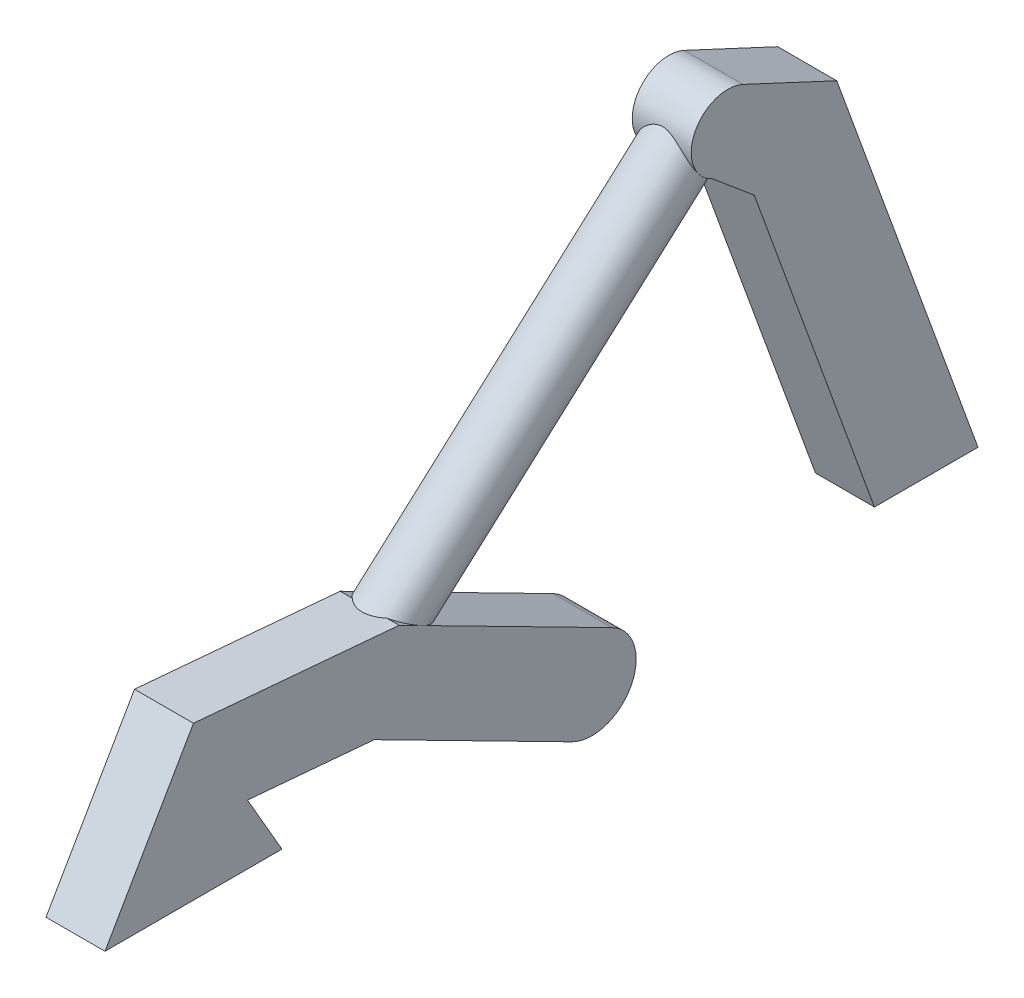
ISO-10303-21;
HEADER;
FILE_DESCRIPTION(('STEP AP214'),'2;1');
FILE_NAME('part.step','',(''),(''),'','','');
FILE_SCHEMA(('AUTOMOTIVE_DESIGN { 1 0 10303 214 1 1 1 1 }'));
ENDSEC;
DATA;
#1=APPLICATION_CONTEXT('core data for automotive mechanical design processes');
#2=APPLICATION_PROTOCOL_DEFINITION('international standard','automotive_design',2000,#1);
#3=PRODUCT_CONTEXT('',#1,'mechanical');
#4=PRODUCT('Part','Part','',(#3));
#5=PRODUCT_RELATED_PRODUCT_CATEGORY('part','',(#4));
#6=PRODUCT_DEFINITION_FORMATION('','',#4);
#7=PRODUCT_DEFINITION_CONTEXT('part definition',#1,'design');
#8=PRODUCT_DEFINITION('design','',#6,#7);
#9=PRODUCT_DEFINITION_SHAPE('','',#8);
#10=(LENGTH_UNIT() NAMED_UNIT(*) SI_UNIT(.MILLI.,.METRE.));
#11=(NAMED_UNIT(*) PLANE_ANGLE_UNIT() SI_UNIT($,.RADIAN.));
#12=(NAMED_UNIT(*) SI_UNIT($,.STERADIAN.) SOLID_ANGLE_UNIT());
#13=UNCERTAINTY_MEASURE_WITH_UNIT(LENGTH_MEASURE(1.E-05),#10,'distance_accuracy_value','');
#14=(GEOMETRIC_REPRESENTATION_CONTEXT(3) GLOBAL_UNCERTAINTY_ASSIGNED_CONTEXT((#13)) GLOBAL_UNIT_ASSIGNED_CONTEXT((#10,
#11,#12)) REPRESENTATION_CONTEXT('',''));
#15=CARTESIAN_POINT('',(0.,0.,0.));
#16=DIRECTION('',(0.,0.,1.));
#17=DIRECTION('',(1.,0.,0.));
#18=AXIS2_PLACEMENT_3D('',#15,#16,#17);
#19=CARTESIAN_POINT('',(10.,135.116782507839,-46.1589220455985));
#20=DIRECTION('',(-1.,0.,0.));
#21=DIRECTION('',(0.,0.,1.));
#22=AXIS2_PLACEMENT_3D('',#19,#20,#21);
#23=CYLINDRICAL_SURFACE('',#22,12.3929461092217);
#24=CARTESIAN_POINT('',(10.,135.116782507839,-46.1589220455985));
#25=DIRECTION('',(1.,0.,0.));
#26=DIRECTION('',(0.,0.,-1.));
#27=AXIS2_PLACEMENT_3D('',#24,#25,#26);
#28=CIRCLE('',#27,12.3929461092217);
#29=CARTESIAN_POINT('',(10.,126.832001120625,-36.942224663556));
#30=VERTEX_POINT('',#29);
#31=CARTESIAN_POINT('',(10.,123.884958944725,-40.921436703073));
#32=VERTEX_POINT('',#31);
#33=EDGE_CURVE('E273',#30,#32,#28,.T.);
#34=ORIENTED_EDGE('',*,*,#33,.F.);
#35=CARTESIAN_POINT('',(0.,137.660232497001,-34.0297845899216));
#36=CARTESIAN_POINT('',(0.185617388111039,137.660227845649,-34.029782344245));
#37=CARTESIAN_POINT('',(0.371287628718437,137.651635477715,-34.0279719432476));
#38=CARTESIAN_POINT('',(0.741080281220519,137.617596346367,-34.0209102225487));
#39=CARTESIAN_POINT('',(0.925201652571605,137.592139046415,-34.0156567517763));
#40=CARTESIAN_POINT('',(1.29087244246461,137.525248293903,-34.0022134190022));
#41=CARTESIAN_POINT('',(1.47241414430979,137.483774443963,-33.9940161357298));
#42=CARTESIAN_POINT('',(1.83143649751296,137.386224911556,-33.9754413621636));
#43=CARTESIAN_POINT('',(2.0089156691407,137.330143997885,-33.9650630910538));
#44=CARTESIAN_POINT('',(2.42148170286248,137.182621751211,-33.9390676477289));
#45=CARTESIAN_POINT('',(2.65457609870836,137.08570009876,-33.9229009714166));
#46=CARTESIAN_POINT('',(3.11124188601631,136.871593659983,-33.8903660513737));
#47=CARTESIAN_POINT('',(3.33480882371188,136.75439952369,-33.8739977178856));
#48=CARTESIAN_POINT('',(3.77277258386033,136.502713874192,-33.8430616639949));
#49=CARTESIAN_POINT('',(3.98714614049267,136.368181571667,-33.8284983538045));
#50=CARTESIAN_POINT('',(4.40628517025914,136.084694458839,-33.8030112242323));
#51=CARTESIAN_POINT('',(4.61105091185512,135.935740051875,-33.7920873031065));
#52=CARTESIAN_POINT('',(5.08672584940331,135.566950336349,-33.7723090417917));
#53=CARTESIAN_POINT('',(5.35345003349578,135.341572095179,-33.7657896346524));
#54=CARTESIAN_POINT('',(5.86944140749157,134.871553385686,-33.7661706634047));
#55=CARTESIAN_POINT('',(6.11870204912542,134.626905764233,-33.7730761055777));
#56=CARTESIAN_POINT('',(6.59918197211624,134.121824795587,-33.8033913116448));
#57=CARTESIAN_POINT('',(6.83041629820708,133.861404941575,-33.8267871452999));
#58=CARTESIAN_POINT('',(7.27408321061637,133.327409120936,-33.8928874059774));
#59=CARTESIAN_POINT('',(7.48652221581721,133.053837695412,-33.9355852104161));
#60=CARTESIAN_POINT('',(7.85051922234475,132.552069551317,-34.0321364413042));
#61=CARTESIAN_POINT('',(8.0057460331362,132.325766835566,-34.0820393448965));
#62=CARTESIAN_POINT('',(8.30211401990539,131.867885412006,-34.1970879164267));
#63=CARTESIAN_POINT('',(8.44325795095002,131.636307747078,-34.2622305945985));
#64=CARTESIAN_POINT('',(8.71002057118677,131.16974688176,-34.408784054249));
#65=CARTESIAN_POINT('',(8.83565759895238,130.934768078416,-34.4901753158721));
#66=CARTESIAN_POINT('',(9.07011065527043,130.46300685522,-34.6701804248383));
#67=CARTESIAN_POINT('',(9.17892952705143,130.226224747346,-34.7687913550574));
#68=CARTESIAN_POINT('',(9.36183151064587,129.791811740053,-34.9661999855142));
#69=CARTESIAN_POINT('',(9.43868455912511,129.594125922529,-35.0623170222117));
#70=CARTESIAN_POINT('',(9.57860348505606,129.200419123077,-35.2671375145468));
#71=CARTESIAN_POINT('',(9.64167202256111,129.00439782697,-35.3758385355974));
#72=CARTESIAN_POINT('',(9.7531511705186,128.615589433037,-35.605695909869));
#73=CARTESIAN_POINT('',(9.80156674975739,128.42280125986,-35.7268480222419));
#74=CARTESIAN_POINT('',(9.88303262076761,128.041997879526,-35.9812522736492));
#75=CARTESIAN_POINT('',(9.91608273042445,127.853982728965,-36.1145045560747));
#76=CARTESIAN_POINT('',(9.96636330589275,127.483679033155,-36.3929251022289));
#77=CARTESIAN_POINT('',(9.98353548990051,127.301413938965,-36.538135152025));
#78=CARTESIAN_POINT('',(10.0015521541064,126.944910354674,-36.839049310746));
#79=CARTESIAN_POINT('',(10.0023966022645,126.770671880324,-36.9947534402629));
#80=CARTESIAN_POINT('',(9.98774295575944,126.431639700967,-37.3154017508537));
#81=CARTESIAN_POINT('',(9.97224453759298,126.266846182989,-37.4803461147747));
#82=CARTESIAN_POINT('',(9.92517520431104,125.947896249709,-37.8180242540213));
#83=CARTESIAN_POINT('',(9.89360469435239,125.793739566378,-37.9907578328906));
#84=CARTESIAN_POINT('',(9.81717979761457,125.505478041357,-38.3323648333129));
#85=CARTESIAN_POINT('',(9.77319102993857,125.370730257988,-38.5008915549412));
#86=CARTESIAN_POINT('',(9.67199363130411,125.11193823907,-38.8422224958738));
#87=CARTESIAN_POINT('',(9.61478046429954,124.987897696264,-39.0150281646809));
#88=CARTESIAN_POINT('',(9.48787302918555,124.750868403838,-39.3635307771089));
#89=CARTESIAN_POINT('',(9.41818143075081,124.637877298245,-39.5392270950082));
#90=CARTESIAN_POINT('',(9.2670609943315,124.422933397685,-39.8923868416701));
#91=CARTESIAN_POINT('',(9.18562785625018,124.320984670819,-40.0698508955668));
#92=CARTESIAN_POINT('',(9.00365571782118,124.11897593729,-40.4420786773415));
#93=CARTESIAN_POINT('',(8.90204054999981,124.019992958387,-40.636901517172));
#94=CARTESIAN_POINT('',(8.68670831453215,123.834755488198,-41.0259427105692));
#95=CARTESIAN_POINT('',(8.57298626030902,123.748506276871,-41.2201607808814));
#96=CARTESIAN_POINT('',(8.21501537571777,123.50812876369,-41.8001237587957));
#97=CARTESIAN_POINT('',(7.9538941012895,123.372297460777,-42.1833150441069));
#98=CARTESIAN_POINT('',(7.50447705344469,123.189669461284,-42.784715692364));
#99=CARTESIAN_POINT('',(7.3283300084292,123.128921076295,-43.0081263910947));
#100=CARTESIAN_POINT('',(6.96279710511278,123.021950047516,-43.4476098922474));
#101=CARTESIAN_POINT('',(6.77340911825087,122.975729745797,-43.663681506534));
#102=CARTESIAN_POINT('',(6.38185346591481,122.896376889522,-44.0869097150452));
#103=CARTESIAN_POINT('',(6.17967017445848,122.863260710335,-44.294054868365));
#104=CARTESIAN_POINT('',(5.76305504761393,122.808657293872,-44.6972370798161));
#105=CARTESIAN_POINT('',(5.54862452935389,122.787168808689,-44.8932753279395));
#106=CARTESIAN_POINT('',(5.12438421766799,122.755415424652,-45.2575128629969));
#107=CARTESIAN_POINT('',(4.91547282852316,122.744418526163,-45.4266947937805));
#108=CARTESIAN_POINT('',(4.48700464231841,122.729470217934,-45.7514633730988));
#109=CARTESIAN_POINT('',(4.26744637784638,122.725519782229,-45.9070481392678));
#110=CARTESIAN_POINT('',(3.81785863215379,122.723036514889,-46.201521120328));
#111=CARTESIAN_POINT('',(3.58784760032396,122.724494478098,-46.3404372896032));
#112=CARTESIAN_POINT('',(3.11692835634695,122.730955600351,-46.5982717138951));
#113=CARTESIAN_POINT('',(2.87602561103622,122.735956998947,-46.7171998630709));
#114=CARTESIAN_POINT('',(2.46241672684556,122.745594282301,-46.8965686047907));
#115=CARTESIAN_POINT('',(2.29253174400326,122.749835792185,-46.9635519635368));
#116=CARTESIAN_POINT('',(1.94827506815974,122.75831542157,-47.0847155996662));
#117=CARTESIAN_POINT('',(1.77390489083282,122.762553541729,-47.138900140707));
#118=CARTESIAN_POINT('',(1.42163978642635,122.770367023548,-47.2328711081545));
#119=CARTESIAN_POINT('',(1.24375225608189,122.773943639988,-47.2726849332365));
#120=CARTESIAN_POINT('',(0.885148902469813,122.779889076509,-47.3367234096876));
#121=CARTESIAN_POINT('',(0.704433150154871,122.782257926839,-47.3609484514982));
#122=CARTESIAN_POINT('',(0.34028958980701,122.785422145411,-47.3929935694511));
#123=CARTESIAN_POINT('',(0.156851705557414,122.786206762697,-47.4007015788273));
#124=CARTESIAN_POINT('',(-0.209941163507109,122.786041779077,-47.3990617090348));
#125=CARTESIAN_POINT('',(-0.393296150072499,122.785092216683,-47.3897142086171));
#126=CARTESIAN_POINT('',(-0.758567026804664,122.781612106409,-47.3543278596963));
#127=CARTESIAN_POINT('',(-0.940481050728082,122.779079768172,-47.328270108512));
#128=CARTESIAN_POINT('',(-1.30132593737375,122.772840258842,-47.2604446807615));
#129=CARTESIAN_POINT('',(-1.48025633442382,122.76913290613,-47.218674575405));
#130=CARTESIAN_POINT('',(-1.87580368980367,122.760181083861,-47.1092856504047));
#131=CARTESIAN_POINT('',(-2.09137340536832,122.754780229076,-47.0378961844125));
#132=CARTESIAN_POINT('',(-2.51532321619482,122.744345932582,-46.8761896295046));
#133=CARTESIAN_POINT('',(-2.72369965141922,122.7393126765,-46.7858630657636));
#134=CARTESIAN_POINT('',(-3.13320402210339,122.730905640987,-46.5889168692017));
#135=CARTESIAN_POINT('',(-3.33431326971771,122.7275358919,-46.4822584780131));
#136=CARTESIAN_POINT('',(-3.7286652950136,122.723691012557,-46.2553126811291));
#137=CARTESIAN_POINT('',(-3.9219076766464,122.723216027855,-46.1350245904119));
#138=CARTESIAN_POINT('',(-4.39274989872695,122.727014243585,-45.8216027477415));
#139=CARTESIAN_POINT('',(-4.66569474279469,122.733707736959,-45.6214816783643));
#140=CARTESIAN_POINT('',(-5.19501432399085,122.759112212562,-45.2010407758676));
#141=CARTESIAN_POINT('',(-5.4513816927366,122.777828498835,-44.9807120646244));
#142=CARTESIAN_POINT('',(-5.94790572148613,122.830047906701,-44.5236086800755));
#143=CARTESIAN_POINT('',(-6.18804491354486,122.863566678263,-44.2868168249117));
#144=CARTESIAN_POINT('',(-6.65143416339483,122.947864738666,-43.8002065948623));
#145=CARTESIAN_POINT('',(-6.87468700095175,122.998641179023,-43.5503903754843));
#146=CARTESIAN_POINT('',(-7.3073876450992,123.120854587414,-43.0357750350746));
#147=CARTESIAN_POINT('',(-7.51650821119445,123.192652504489,-42.7707854295551));
#148=CARTESIAN_POINT('',(-7.91485333923351,123.358783208945,-42.232880322209));
#149=CARTESIAN_POINT('',(-8.10407469215206,123.453119622971,-41.9599635510452));
#150=CARTESIAN_POINT('',(-8.45997022091401,123.66603229766,-41.4100114685174));
#151=CARTESIAN_POINT('',(-8.62670396661728,123.784542340346,-41.1329892854598));
#152=CARTESIAN_POINT('',(-8.93555472675595,124.047535632594,-40.5776010858904));
#153=CARTESIAN_POINT('',(-9.07768540744318,124.192004371407,-40.2992359042768));
#154=CARTESIAN_POINT('',(-9.29333035214052,124.457249129402,-39.8338509259419));
#155=CARTESIAN_POINT('',(-9.37424659997567,124.570809873277,-39.6461094256265));
#156=CARTESIAN_POINT('',(-9.52242942930216,124.810400058175,-39.2732369689498));
#157=CARTESIAN_POINT('',(-9.58969958370274,124.936426222531,-39.0881053410977));
#158=CARTESIAN_POINT('',(-9.70967292322671,125.200701048206,-38.7220289702201));
#159=CARTESIAN_POINT('',(-9.76238377002485,125.33894323023,-38.5410820711411));
#160=CARTESIAN_POINT('',(-9.85250103162645,125.627232924191,-38.1848352778923));
#161=CARTESIAN_POINT('',(-9.88990693329777,125.77728083174,-38.0095355732387));
#162=CARTESIAN_POINT('',(-9.94892333295413,126.089039052383,-37.6654493816061));
#163=CARTESIAN_POINT('',(-9.97046723468241,126.250795439581,-37.4966931421208));
#164=CARTESIAN_POINT('',(-9.99712777227604,126.584311017971,-37.1679899611522));
#165=CARTESIAN_POINT('',(-10.002244466364,126.756070173708,-37.0080429884484));
#166=CARTESIAN_POINT('',(-9.99595955810509,127.108230185319,-36.6983092854418));
#167=CARTESIAN_POINT('',(-9.98455776788941,127.288631139456,-36.5485226707155));
#168=CARTESIAN_POINT('',(-9.94543752928521,127.656519347745,-36.2602252274252));
#169=CARTESIAN_POINT('',(-9.9177195663851,127.844006390894,-36.1217140634992));
#170=CARTESIAN_POINT('',(-9.84866084295106,128.212584063644,-35.8650196179466));
#171=CARTESIAN_POINT('',(-9.8082734970707,128.393348342001,-35.746108030638));
#172=CARTESIAN_POINT('',(-9.71412090706139,128.758346441954,-35.5192985695859));
#173=CARTESIAN_POINT('',(-9.66035112347811,128.942581421206,-35.4114044506261));
#174=CARTESIAN_POINT('',(-9.54014474540655,129.313090628267,-35.2068881899547));
#175=CARTESIAN_POINT('',(-9.47371075290034,129.499364429782,-35.1102637393443));
#176=CARTESIAN_POINT('',(-9.32890983267027,129.872808267048,-34.9282040146237));
#177=CARTESIAN_POINT('',(-9.25053851077444,130.059978608143,-34.8427728824425));
#178=CARTESIAN_POINT('',(-9.0756175461254,130.449719385352,-34.6762302035071));
#179=CARTESIAN_POINT('',(-8.97809461661392,130.652265001069,-34.5960816881114));
#180=CARTESIAN_POINT('',(-8.77094059594704,131.055745600162,-34.4482715809192));
#181=CARTESIAN_POINT('',(-8.66130453467648,131.256679885856,-34.3806151453638));
#182=CARTESIAN_POINT('',(-8.31559297966031,131.855331704186,-34.1955520306362));
#183=CARTESIAN_POINT('',(-8.06263357007679,132.249076167839,-34.0959772813197));
#184=CARTESIAN_POINT('',(-7.62694556869369,132.863985607231,-33.9701653089664));
#185=CARTESIAN_POINT('',(-7.45640414842928,133.091392100758,-33.9305159423961));
#186=CARTESIAN_POINT('',(-7.10229063894494,133.537908413272,-33.864894939836));
#187=CARTESIAN_POINT('',(-6.91872010274092,133.757019216314,-33.8389216768087));
#188=CARTESIAN_POINT('',(-6.53897164320588,134.185730636168,-33.799120569053));
#189=CARTESIAN_POINT('',(-6.34277529417056,134.395316555695,-33.7853109275568));
#190=CARTESIAN_POINT('',(-5.93840337793363,134.803025580353,-33.7682692605707));
#191=CARTESIAN_POINT('',(-5.73022876157448,135.00114959284,-33.7650363966649));
#192=CARTESIAN_POINT('',(-5.3078551389984,135.378814643755,-33.7673472792814));
#193=CARTESIAN_POINT('',(-5.09397717656024,135.558715972977,-33.772653128556));
#194=CARTESIAN_POINT('',(-4.65478866836263,135.903784604698,-33.7897840690279));
#195=CARTESIAN_POINT('',(-4.42947603255128,136.068949198261,-33.8016103559685));
#196=CARTESIAN_POINT('',(-3.96752039342706,136.381515056598,-33.8296825202761));
#197=CARTESIAN_POINT('',(-3.73089373747899,136.528940928842,-33.8459221709423));
#198=CARTESIAN_POINT('',(-3.24588491209372,136.802672730848,-33.8804081870317));
#199=CARTESIAN_POINT('',(-2.99750955529894,136.928990712264,-33.8986533974368));
#200=CARTESIAN_POINT('',(-2.57210196861974,137.11904794545,-33.9285470930875));
#201=CARTESIAN_POINT('',(-2.39819480509239,137.189766220384,-33.9404078672538));
#202=CARTESIAN_POINT('',(-2.04552260598624,137.318007062826,-33.9628586778503));
#203=CARTESIAN_POINT('',(-1.86675936151091,137.375534423666,-33.9734491752058));
#204=CARTESIAN_POINT('',(-1.50556261324725,137.475669364872,-33.9924367771256));
#205=CARTESIAN_POINT('',(-1.32314228678677,137.518322892255,-34.0008406157441));
#206=CARTESIAN_POINT('',(-0.955222990889543,137.58750815272,-34.0147098215645));
#207=CARTESIAN_POINT('',(-0.769726162638301,137.61405065185,-34.02017715078));
#208=CARTESIAN_POINT('',(-0.486493185573035,137.641409506068,-34.0258494612921));
#209=CARTESIAN_POINT('',(-0.389351214910032,137.648458965216,-34.0273206937813));
#210=CARTESIAN_POINT('',(-0.194811046867117,137.657872154117,-34.0292889456895));
#211=CARTESIAN_POINT('',(-0.0974128017387737,137.66023493805,-34.0297857684622));
#212=CARTESIAN_POINT('',(0.,137.660232497001,-34.0297845899216));
#213=B_SPLINE_CURVE_WITH_KNOTS('',3,(#35,#36,#37,#38,#39,#40,#41,#42,#43,#44,#45,#46,#47,#48,
#49,#50,#51,#52,#53,#54,#55,#56,#57,#58,#59,#60,#61,#62,#63,#64,#65,#66,#67,#68,#69,#70,#71,#72,
#73,#74,#75,#76,#77,#78,#79,#80,#81,#82,#83,#84,#85,#86,#87,#88,#89,#90,#91,#92,#93,#94,#95,#96,
#97,#98,#99,#100,#101,#102,#103,#104,#105,#106,#107,#108,#109,#110,#111,#112,#113,#114,#115,
#116,#117,#118,#119,#120,#121,#122,#123,#124,#125,#126,#127,#128,#129,#130,#131,#132,#133,#134,
#135,#136,#137,#138,#139,#140,#141,#142,#143,#144,#145,#146,#147,#148,#149,#150,#151,#152,#153,
#154,#155,#156,#157,#158,#159,#160,#161,#162,#163,#164,#165,#166,#167,#168,#169,#170,#171,#172,
#173,#174,#175,#176,#177,#178,#179,#180,#181,#182,#183,#184,#185,#186,#187,#188,#189,#190,#191,
#192,#193,#194,#195,#196,#197,#198,#199,#200,#201,#202,#203,#204,#205,#206,#207,#208,#209,#210,
#211,#212),.UNSPECIFIED.,.T.,.F.,(4,2,2,2,2,2,2,2,2,2,2,2,2,2,2,2,2,2,2,2,2,2,2,2,2,2,2,2,2,2,2,
2,2,2,2,2,2,2,2,2,2,2,2,2,2,2,2,2,2,2,2,2,2,2,2,2,2,2,2,2,2,2,2,2,2,2,2,2,2,2,2,2,2,2,2,2,2,2,2,
2,2,2,2,2,2,2,2,2,4),(0.,0.556741218736727,1.11383059566347,1.67233435361859,2.23103840333152,
2.98870448733712,3.74672095430042,4.50655442567159,5.26636665309445,6.31278251185985,
7.35958866605391,8.40551159013281,9.45107592589922,10.2871023060872,11.1229648104603,
11.9578291489108,12.792552192872,13.4904372816994,14.1881875776538,14.8857010022108,
15.5832226936242,16.283294673169,16.9833680264667,17.6834552378127,18.3835248017316,
19.0434473370297,19.7035965663968,20.3636047297612,21.0238552243636,21.7461275182899,
22.46869846073,23.9133350259096,24.7854684231504,25.6577423448822,26.5311028740309,
27.4043696538222,28.2109248931388,29.0175916141428,29.822886009467,30.6277805988599,
31.1753372453747,31.722711226816,32.2690360230336,32.8153471352963,33.3653533405643,
33.9153473320163,34.4659645782711,35.0166669730478,35.6970468184356,36.3777678951356,
37.0601302263756,37.7425268680254,38.7566318658343,39.7711845594758,40.7868124694158,
41.8022728251409,42.8363088634777,43.8705113996401,44.9019181341058,45.9327501022347,
46.6336656776485,47.3343974972272,48.0347598588157,48.7351456996776,49.4384555835128,
50.1417629746194,50.8450783646784,51.5483728286162,52.2079701609072,52.867791540765,
53.5274774998791,54.1874068811462,54.9026778172336,55.618243332344,57.0487528773875,
57.9091648561757,58.7694744491474,59.6310693449355,60.4925959408779,61.3305322137561,
62.1686222017864,63.00553583451,63.841969982402,64.4058504890511,64.9695257662705,
65.5314440297786,66.0929863819544,66.3851076153215,66.6772877958127),.UNSPECIFIED.);
#214=CARTESIAN_POINT('',(8.74410709788623,123.884958944725,-40.921436703073));
#215=VERTEX_POINT('',#214);
#216=EDGE_CURVE('E342',#30,#215,#213,.T.);
#217=ORIENTED_EDGE('',*,*,#216,.T.);
#218=DIRECTION('',(-1.,0.,0.));
#219=VECTOR('',#218,1.);
#220=CARTESIAN_POINT('',(10.,123.884958944725,-40.921436703073));
#221=LINE('',#220,#219);
#222=EDGE_CURVE('E68',#32,#215,#221,.T.);
#223=ORIENTED_EDGE('',*,*,#222,.F.);
#224=EDGE_LOOP('',(#34,#217,#223));
#225=FACE_BOUND('',#224,.T.);
#226=ADVANCED_FACE('F41',(#225),#23,.T.);
#227=CARTESIAN_POINT('',(-8.74410709788623,123.884958944725,-40.921436703073));
#228=VERTEX_POINT('',#227);
#229=CARTESIAN_POINT('',(-10.,123.884958944725,-40.921436703073));
#230=VERTEX_POINT('',#229);
#231=EDGE_CURVE('E328',#228,#230,#221,.T.);
#232=ORIENTED_EDGE('',*,*,#231,.F.);
#233=CARTESIAN_POINT('',(-10.,126.832001120625,-36.942224663556));
#234=VERTEX_POINT('',#233);
#235=EDGE_CURVE('E343',#228,#234,#213,.T.);
#236=ORIENTED_EDGE('',*,*,#235,.T.);
#237=CARTESIAN_POINT('',(-10.,135.116782507839,-46.1589220455985));
#238=DIRECTION('',(1.,0.,0.));
#239=DIRECTION('',(0.,0.,-1.));
#240=AXIS2_PLACEMENT_3D('',#237,#238,#239);
#241=CIRCLE('',#240,12.3929461092217);
#242=EDGE_CURVE('E297',#234,#230,#241,.T.);
#243=ORIENTED_EDGE('',*,*,#242,.T.);
#244=EDGE_LOOP('',(#232,#236,#243));
#245=FACE_BOUND('',#244,.T.);
#246=ADVANCED_FACE('F348',(#245),#23,.T.);
#247=CARTESIAN_POINT('',(-10.,146.348606070952,-51.3964073881239));
#248=VERTEX_POINT('',#247);
#249=EDGE_CURVE('E298',#248,#234,#241,.T.);
#250=ORIENTED_EDGE('',*,*,#249,.T.);
#251=EDGE_CURVE('E335',#234,#30,#213,.T.);
#252=ORIENTED_EDGE('',*,*,#251,.T.);
#253=CARTESIAN_POINT('',(10.,146.348606070952,-51.3964073881239));
#254=VERTEX_POINT('',#253);
#255=EDGE_CURVE('E275',#254,#30,#28,.T.);
#256=ORIENTED_EDGE('',*,*,#255,.F.);
#257=DIRECTION('',(-1.,0.,0.));
#258=VECTOR('',#257,1.);
#259=CARTESIAN_POINT('',(10.,146.348606070952,-51.3964073881239));
#260=LINE('',#259,#258);
#261=EDGE_CURVE('E331',#254,#248,#260,.T.);
#262=ORIENTED_EDGE('',*,*,#261,.T.);
#263=EDGE_LOOP('',(#250,#252,#256,#262));
#264=FACE_BOUND('',#263,.T.);
#265=ADVANCED_FACE('F350',(#264),#23,.T.);
#266=CARTESIAN_POINT('',(10.,139.895804512104,-65.2344849877486));
#267=DIRECTION('',(0.,-0.90630778703665,0.4226182617407));
#268=DIRECTION('',(0.,-0.4226182617407,-0.90630778703665));
#269=AXIS2_PLACEMENT_3D('',#266,#267,#268);
#270=PLANE('',#269);
#271=DIRECTION('',(0.,0.4226182617407,0.90630778703665));
#272=VECTOR('',#271,1.);
#273=CARTESIAN_POINT('',(-10.,139.895804512104,-65.2344849877486));
#274=LINE('',#273,#272);
#275=CARTESIAN_POINT('',(-10.,131.556966910027,-83.1171799344067));
#276=VERTEX_POINT('',#275);
#277=EDGE_CURVE('E176',#276,#248,#274,.T.);
#278=ORIENTED_EDGE('',*,*,#277,.T.);
#279=ORIENTED_EDGE('',*,*,#261,.F.);
#280=DIRECTION('',(0.,0.4226182617407,0.90630778703665));
#281=VECTOR('',#280,1.);
#282=CARTESIAN_POINT('',(10.,139.895804512104,-65.2344849877486));
#283=LINE('',#282,#281);
#284=CARTESIAN_POINT('',(10.,131.556966910027,-83.1171799344067));
#285=VERTEX_POINT('',#284);
#286=EDGE_CURVE('E269',#285,#254,#283,.T.);
#287=ORIENTED_EDGE('',*,*,#286,.F.);
#288=DIRECTION('',(-1.,0.,0.));
#289=VECTOR('',#288,1.);
#290=CARTESIAN_POINT('',(10.,131.556966910027,-83.1171799344067));
#291=LINE('',#290,#289);
#292=EDGE_CURVE('E293',#285,#276,#291,.T.);
#293=ORIENTED_EDGE('',*,*,#292,.T.);
#294=EDGE_LOOP('',(#278,#279,#287,#293));
#295=FACE_BOUND('',#294,.T.);
#296=ADVANCED_FACE('F353',(#295),#270,.F.);
#297=CARTESIAN_POINT('',(10.,92.848552217702,-77.9091859212183));
#298=DIRECTION('',(0.,-0.766044443118978,0.64278760968654));
#299=DIRECTION('',(0.,-0.64278760968654,-0.766044443118978));
#300=AXIS2_PLACEMENT_3D('',#297,#298,#299);
#301=PLANE('',#300);
#302=CARTESIAN_POINT('',(0.,127.034698828497,-37.1677228808508));
#303=DIRECTION('',(0.,-0.766044443118978,0.64278760968654));
#304=DIRECTION('',(0.,-0.64278760968654,-0.766044443118978));
#305=AXIS2_PLACEMENT_3D('',#302,#303,#304);
#306=ELLIPSE('',#305,10.0994683266074,10.);
#307=EDGE_CURVE('E344',#228,#215,#306,.T.);
#308=ORIENTED_EDGE('',*,*,#307,.F.);
#309=ORIENTED_EDGE('',*,*,#231,.T.);
#310=DIRECTION('',(0.,0.64278760968654,0.766044443118978));
#311=VECTOR('',#310,1.);
#312=CARTESIAN_POINT('',(-10.,92.848552217702,-77.9091859212183));
#313=LINE('',#312,#311);
#314=CARTESIAN_POINT('',(-10.,111.961236177469,-55.1315761480483));
#315=VERTEX_POINT('',#314);
#316=EDGE_CURVE('E302',#315,#230,#313,.T.);
#317=ORIENTED_EDGE('',*,*,#316,.F.);
#318=DIRECTION('',(-1.,0.,0.));
#319=VECTOR('',#318,1.);
#320=CARTESIAN_POINT('',(10.,111.961236177469,-55.1315761480483));
#321=LINE('',#320,#319);
#322=CARTESIAN_POINT('',(10.,111.961236177469,-55.1315761480483));
#323=VERTEX_POINT('',#322);
#324=EDGE_CURVE('E325',#323,#315,#321,.T.);
#325=ORIENTED_EDGE('',*,*,#324,.F.);
#326=DIRECTION('',(0.,0.64278760968654,0.766044443118978));
#327=VECTOR('',#326,1.);
#328=CARTESIAN_POINT('',(10.,92.848552217702,-77.9091859212183));
#329=LINE('',#328,#327);
#330=EDGE_CURVE('E279',#323,#32,#329,.T.);
#331=ORIENTED_EDGE('',*,*,#330,.T.);
#332=ORIENTED_EDGE('',*,*,#222,.T.);
#333=EDGE_LOOP('',(#308,#309,#317,#325,#331,#332));
#334=FACE_BOUND('',#333,.T.);
#335=ADVANCED_FACE('F351',(#334),#301,.T.);
#336=CARTESIAN_POINT('',(10.,30.815923704721,-84.6660545383582));
#337=DIRECTION('',(0.,-0.342020143325666,0.939692620785909));
#338=DIRECTION('',(0.,-0.939692620785909,-0.342020143325666));
#339=AXIS2_PLACEMENT_3D('',#336,#337,#338);
#340=PLANE('',#339);
#341=DIRECTION('',(0.,0.939692620785909,0.342020143325666));
#342=VECTOR('',#341,1.);
#343=CARTESIAN_POINT('',(-10.,30.815923704721,-84.6660545383582));
#344=LINE('',#343,#342);
#345=CARTESIAN_POINT('',(-10.,0.,-95.8821335082949));
#346=VERTEX_POINT('',#345);
#347=EDGE_CURVE('E306',#346,#315,#344,.T.);
#348=ORIENTED_EDGE('',*,*,#347,.F.);
#349=DIRECTION('',(-1.,0.,0.));
#350=VECTOR('',#349,1.);
#351=CARTESIAN_POINT('',(10.,0.,-95.8821335082949));
#352=LINE('',#351,#350);
#353=CARTESIAN_POINT('',(10.,0.,-95.8821335082949));
#354=VERTEX_POINT('',#353);
#355=EDGE_CURVE('E322',#354,#346,#352,.T.);
#356=ORIENTED_EDGE('',*,*,#355,.F.);
#357=DIRECTION('',(0.,0.939692620785909,0.342020143325666));
#358=VECTOR('',#357,1.);
#359=CARTESIAN_POINT('',(10.,30.815923704721,-84.6660545383582));
#360=LINE('',#359,#358);
#361=EDGE_CURVE('E282',#354,#323,#360,.T.);
#362=ORIENTED_EDGE('',*,*,#361,.T.);
#363=ORIENTED_EDGE('',*,*,#324,.T.);
#364=EDGE_LOOP('',(#348,#356,#362,#363));
#365=FACE_BOUND('',#364,.T.);
#366=ADVANCED_FACE('F360',(#365),#340,.T.);
#367=CARTESIAN_POINT('',(10.,0.,0.));
#368=DIRECTION('',(0.,-1.,0.));
#369=DIRECTION('',(0.,0.,-1.));
#370=AXIS2_PLACEMENT_3D('',#367,#368,#369);
#371=PLANE('',#370);
#372=DIRECTION('',(0.,0.,1.));
#373=VECTOR('',#372,1.);
#374=CARTESIAN_POINT('',(-10.,0.,0.));
#375=LINE('',#374,#373);
#376=CARTESIAN_POINT('',(-10.,0.,-131.));
#377=VERTEX_POINT('',#376);
#378=EDGE_CURVE('E310',#377,#346,#375,.T.);
#379=ORIENTED_EDGE('',*,*,#378,.F.);
#380=DIRECTION('',(-1.,0.,0.));
#381=VECTOR('',#380,1.);
#382=CARTESIAN_POINT('',(10.,0.,-131.));
#383=LINE('',#382,#381);
#384=CARTESIAN_POINT('',(10.,0.,-131.));
#385=VERTEX_POINT('',#384);
#386=EDGE_CURVE('E319',#385,#377,#383,.T.);
#387=ORIENTED_EDGE('',*,*,#386,.F.);
#388=DIRECTION('',(0.,0.,1.));
#389=VECTOR('',#388,1.);
#390=CARTESIAN_POINT('',(10.,0.,0.));
#391=LINE('',#390,#389);
#392=EDGE_CURVE('E286',#385,#354,#391,.T.);
#393=ORIENTED_EDGE('',*,*,#392,.T.);
#394=ORIENTED_EDGE('',*,*,#355,.T.);
#395=EDGE_LOOP('',(#379,#387,#393,#394));
#396=FACE_BOUND('',#395,.T.);
#397=ADVANCED_FACE('F383',(#396),#371,.T.);
#398=CARTESIAN_POINT('',(10.,42.1025884344681,-115.675911024293));
#399=DIRECTION('',(0.,-0.342020143325666,0.939692620785909));
#400=DIRECTION('',(0.,-0.939692620785909,-0.342020143325666));
#401=AXIS2_PLACEMENT_3D('',#398,#399,#400);
#402=PLANE('',#401);
#403=DIRECTION('',(0.,0.939692620785909,0.342020143325666));
#404=VECTOR('',#403,1.);
#405=CARTESIAN_POINT('',(-10.,42.1025884344681,-115.675911024293));
#406=LINE('',#405,#404);
#407=EDGE_CURVE('E274',#377,#276,#406,.T.);
#408=ORIENTED_EDGE('',*,*,#407,.T.);
#409=ORIENTED_EDGE('',*,*,#292,.F.);
#410=DIRECTION('',(0.,0.939692620785909,0.342020143325666));
#411=VECTOR('',#410,1.);
#412=CARTESIAN_POINT('',(10.,42.1025884344681,-115.675911024293));
#413=LINE('',#412,#411);
#414=EDGE_CURVE('E290',#385,#285,#413,.T.);
#415=ORIENTED_EDGE('',*,*,#414,.F.);
#416=ORIENTED_EDGE('',*,*,#386,.T.);
#417=EDGE_LOOP('',(#408,#409,#415,#416));
#418=FACE_BOUND('',#417,.T.);
#419=ADVANCED_FACE('F381',(#418),#402,.F.);
#420=CARTESIAN_POINT('',(10.,0.,0.));
#421=DIRECTION('',(1.,0.,0.));
#422=DIRECTION('',(0.,0.,-1.));
#423=AXIS2_PLACEMENT_3D('',#420,#421,#422);
#424=PLANE('',#423);
#425=ORIENTED_EDGE('',*,*,#286,.T.);
#426=ORIENTED_EDGE('',*,*,#255,.T.);
#427=ORIENTED_EDGE('',*,*,#33,.T.);
#428=ORIENTED_EDGE('',*,*,#330,.F.);
#429=ORIENTED_EDGE('',*,*,#361,.F.);
#430=ORIENTED_EDGE('',*,*,#392,.F.);
#431=ORIENTED_EDGE('',*,*,#414,.T.);
#432=EDGE_LOOP('',(#425,#426,#427,#428,#429,#430,#431));
#433=FACE_BOUND('',#432,.T.);
#434=ADVANCED_FACE('F376',(#433),#424,.T.);
#435=CARTESIAN_POINT('',(-10.,0.,0.));
#436=DIRECTION('',(1.,0.,0.));
#437=DIRECTION('',(0.,0.,-1.));
#438=AXIS2_PLACEMENT_3D('',#435,#436,#437);
#439=PLANE('',#438);
#440=ORIENTED_EDGE('',*,*,#277,.F.);
#441=ORIENTED_EDGE('',*,*,#407,.F.);
#442=ORIENTED_EDGE('',*,*,#378,.T.);
#443=ORIENTED_EDGE('',*,*,#347,.T.);
#444=ORIENTED_EDGE('',*,*,#316,.T.);
#445=ORIENTED_EDGE('',*,*,#242,.F.);
#446=ORIENTED_EDGE('',*,*,#249,.F.);
#447=EDGE_LOOP('',(#440,#441,#442,#443,#444,#445,#446));
#448=FACE_BOUND('',#447,.T.);
#449=ADVANCED_FACE('F368',(#448),#439,.F.);
#450=CARTESIAN_POINT('',(0.,135.116782507839,-46.1589220455985));
#451=DIRECTION('',(0.,0.668507820029091,-0.743705112635346));
#452=DIRECTION('',(0.,0.743705112635346,0.668507820029091));
#453=AXIS2_PLACEMENT_3D('',#450,#451,#452);
#454=CYLINDRICAL_SURFACE('',#453,10.);
#455=CARTESIAN_POINT('',(0.,41.9163131420561,57.5252286713371));
#456=DIRECTION('',(0.,0.891006524188365,-0.453990499739552));
#457=DIRECTION('',(0.,-0.453990499739552,-0.891006524188365));
#458=AXIS2_PLACEMENT_3D('',#455,#456,#457);
#459=ELLIPSE('',#458,10.7148993160706,10.);
#460=CARTESIAN_POINT('',(10.,41.9163131420561,57.5252286713371));
#461=VERTEX_POINT('',#460);
#462=CARTESIAN_POINT('',(-10.,41.9163131420561,57.5252286713371));
#463=VERTEX_POINT('',#462);
#464=EDGE_CURVE('E53',#461,#463,#459,.T.);
#465=ORIENTED_EDGE('',*,*,#464,.T.);
#466=CARTESIAN_POINT('',(-5.85265512141445,45.8606222347297,65.2663711335776));
#467=VERTEX_POINT('',#466);
#468=EDGE_CURVE('E11',#463,#467,#459,.T.);
#469=ORIENTED_EDGE('',*,*,#468,.T.);
#470=CARTESIAN_POINT('',(0.,44.8935828137018,54.213059972397));
#471=DIRECTION('',(0.,0.996194698091745,-0.0871557427476647));
#472=DIRECTION('',(0.,-0.0871557427476647,-0.996194698091745));
#473=AXIS2_PLACEMENT_3D('',#470,#471,#472);
#474=ELLIPSE('',#473,13.683969218166,10.);
#475=CARTESIAN_POINT('',(5.85265512141447,45.8606222347297,65.2663711335776));
#476=VERTEX_POINT('',#475);
#477=EDGE_CURVE('E46',#467,#476,#474,.T.);
#478=ORIENTED_EDGE('',*,*,#477,.T.);
#479=EDGE_CURVE('E52',#476,#461,#459,.T.);
#480=ORIENTED_EDGE('',*,*,#479,.T.);
#481=EDGE_LOOP('',(#465,#469,#478,#480));
#482=FACE_BOUND('',#481,.T.);
#483=ORIENTED_EDGE('',*,*,#235,.F.);
#484=ORIENTED_EDGE('',*,*,#307,.T.);
#485=ORIENTED_EDGE('',*,*,#216,.F.);
#486=ORIENTED_EDGE('',*,*,#251,.F.);
#487=EDGE_LOOP('',(#483,#484,#485,#486));
#488=FACE_BOUND('',#487,.T.);
#489=ADVANCED_FACE('F43',(#482,#488),#454,.T.);
#490=CARTESIAN_POINT('',(10.,10.0076081185062,-5.09913102494604));
#491=DIRECTION('',(0.,0.891006524188365,-0.453990499739552));
#492=DIRECTION('',(0.,0.453990499739552,0.891006524188365));
#493=AXIS2_PLACEMENT_3D('',#490,#491,#492);
#494=PLANE('',#493);
#495=ORIENTED_EDGE('',*,*,#468,.F.);
#496=DIRECTION('',(0.,-0.453990499739552,-0.891006524188365));
#497=VECTOR('',#496,1.);
#498=CARTESIAN_POINT('',(-10.,10.0076081185062,-5.09913102494604));
#499=LINE('',#498,#497);
#500=CARTESIAN_POINT('',(-10.,45.8606222347297,65.2663711335776));
#501=VERTEX_POINT('',#500);
#502=EDGE_CURVE('E216',#501,#463,#499,.T.);
#503=ORIENTED_EDGE('',*,*,#502,.F.);
#504=DIRECTION('',(-1.,0.,0.));
#505=VECTOR('',#504,1.);
#506=CARTESIAN_POINT('',(10.,45.8606222347297,65.2663711335776));
#507=LINE('',#506,#505);
#508=EDGE_CURVE('E177',#467,#501,#507,.T.);
#509=ORIENTED_EDGE('',*,*,#508,.F.);
#510=EDGE_LOOP('',(#495,#503,#509));
#511=FACE_BOUND('',#510,.T.);
#512=ADVANCED_FACE('F398',(#511),#494,.T.);
#513=ORIENTED_EDGE('',*,*,#479,.F.);
#514=CARTESIAN_POINT('',(10.,45.8606222347297,65.2663711335776));
#515=VERTEX_POINT('',#514);
#516=EDGE_CURVE('E60',#515,#476,#507,.T.);
#517=ORIENTED_EDGE('',*,*,#516,.F.);
#518=DIRECTION('',(0.,-0.453990499739552,-0.891006524188365));
#519=VECTOR('',#518,1.);
#520=CARTESIAN_POINT('',(10.,10.0076081185062,-5.09913102494604));
#521=LINE('',#520,#519);
#522=EDGE_CURVE('E172',#515,#461,#521,.T.);
#523=ORIENTED_EDGE('',*,*,#522,.T.);
#524=EDGE_LOOP('',(#513,#517,#523));
#525=FACE_BOUND('',#524,.T.);
#526=ADVANCED_FACE('F171',(#525),#494,.T.);
#527=ORIENTED_EDGE('',*,*,#464,.F.);
#528=CARTESIAN_POINT('',(10.,9.08739175582597,-6.90515732567998));
#529=VERTEX_POINT('',#528);
#530=EDGE_CURVE('E187',#461,#529,#521,.T.);
#531=ORIENTED_EDGE('',*,*,#530,.T.);
#532=DIRECTION('',(-1.,0.,0.));
#533=VECTOR('',#532,1.);
#534=CARTESIAN_POINT('',(10.,9.08739175582597,-6.90515732567998));
#535=LINE('',#534,#533);
#536=CARTESIAN_POINT('',(-10.,9.08739175582597,-6.90515732567998));
#537=VERTEX_POINT('',#536);
#538=EDGE_CURVE('E215',#529,#537,#535,.T.);
#539=ORIENTED_EDGE('',*,*,#538,.T.);
#540=EDGE_CURVE('E221',#463,#537,#499,.T.);
#541=ORIENTED_EDGE('',*,*,#540,.F.);
#542=EDGE_LOOP('',(#527,#531,#539,#541));
#543=FACE_BOUND('',#542,.T.);
#544=ADVANCED_FACE('F431',(#543),#494,.T.);
#545=CARTESIAN_POINT('',(10.,39.8455660795877,-3.48603532373728));
#546=DIRECTION('',(0.,0.996194698091745,-0.0871557427476647));
#547=DIRECTION('',(0.,0.0871557427476647,0.996194698091745));
#548=AXIS2_PLACEMENT_3D('',#545,#546,#547);
#549=PLANE('',#548);
#550=ORIENTED_EDGE('',*,*,#477,.F.);
#551=ORIENTED_EDGE('',*,*,#508,.T.);
#552=DIRECTION('',(0.,-0.0871557427476647,-0.996194698091745));
#553=VECTOR('',#552,1.);
#554=CARTESIAN_POINT('',(-10.,39.8455660795877,-3.48603532373728));
#555=LINE('',#554,#553);
#556=CARTESIAN_POINT('',(-10.,51.9615242270662,135.));
#557=VERTEX_POINT('',#556);
#558=EDGE_CURVE('E220',#557,#501,#555,.T.);
#559=ORIENTED_EDGE('',*,*,#558,.F.);
#560=DIRECTION('',(-1.,0.,0.));
#561=VECTOR('',#560,1.);
#562=CARTESIAN_POINT('',(10.,51.9615242270662,135.));
#563=LINE('',#562,#561);
#564=CARTESIAN_POINT('',(10.,51.9615242270662,135.));
#565=VERTEX_POINT('',#564);
#566=EDGE_CURVE('E192',#565,#557,#563,.T.);
#567=ORIENTED_EDGE('',*,*,#566,.F.);
#568=DIRECTION('',(0.,-0.0871557427476647,-0.996194698091745));
#569=VECTOR('',#568,1.);
#570=CARTESIAN_POINT('',(10.,39.8455660795877,-3.48603532373728));
#571=LINE('',#570,#569);
#572=EDGE_CURVE('E184',#565,#515,#571,.T.);
#573=ORIENTED_EDGE('',*,*,#572,.T.);
#574=ORIENTED_EDGE('',*,*,#516,.T.);
#575=EDGE_LOOP('',(#550,#551,#559,#567,#573,#574));
#576=FACE_BOUND('',#575,.T.);
#577=ADVANCED_FACE('F190',(#576),#549,.T.);
#578=CARTESIAN_POINT('',(10.,71.4470958122165,123.749999999999));
#579=DIRECTION('',(0.,0.500000000000003,0.866025403784437));
#580=DIRECTION('',(0.,-0.866025403784437,0.500000000000003));
#581=AXIS2_PLACEMENT_3D('',#578,#579,#580);
#582=PLANE('',#581);
#583=DIRECTION('',(0.,0.866025403784437,-0.500000000000003));
#584=VECTOR('',#583,1.);
#585=CARTESIAN_POINT('',(-10.,71.4470958122165,123.749999999999));
#586=LINE('',#585,#584);
#587=CARTESIAN_POINT('',(-10.,0.,165.));
#588=VERTEX_POINT('',#587);
#589=EDGE_CURVE('E225',#588,#557,#586,.T.);
#590=ORIENTED_EDGE('',*,*,#589,.F.);
#591=DIRECTION('',(-1.,0.,0.));
#592=VECTOR('',#591,1.);
#593=CARTESIAN_POINT('',(10.,0.,165.));
#594=LINE('',#593,#592);
#595=CARTESIAN_POINT('',(10.,0.,165.));
#596=VERTEX_POINT('',#595);
#597=EDGE_CURVE('E264',#596,#588,#594,.T.);
#598=ORIENTED_EDGE('',*,*,#597,.F.);
#599=DIRECTION('',(0.,0.866025403784437,-0.500000000000003));
#600=VECTOR('',#599,1.);
#601=CARTESIAN_POINT('',(10.,71.4470958122165,123.749999999999));
#602=LINE('',#601,#600);
#603=EDGE_CURVE('E194',#596,#565,#602,.T.);
#604=ORIENTED_EDGE('',*,*,#603,.T.);
#605=ORIENTED_EDGE('',*,*,#566,.T.);
#606=EDGE_LOOP('',(#590,#598,#604,#605));
#607=FACE_BOUND('',#606,.T.);
#608=ADVANCED_FACE('F407',(#607),#582,.T.);
#609=CARTESIAN_POINT('',(10.,0.,0.));
#610=DIRECTION('',(0.,1.,0.));
#611=DIRECTION('',(0.,0.,1.));
#612=AXIS2_PLACEMENT_3D('',#609,#610,#611);
#613=PLANE('',#612);
#614=DIRECTION('',(0.,0.,-1.));
#615=VECTOR('',#614,1.);
#616=CARTESIAN_POINT('',(-10.,0.,0.));
#617=LINE('',#616,#615);
#618=CARTESIAN_POINT('',(-10.,0.,105.));
#619=VERTEX_POINT('',#618);
#620=EDGE_CURVE('E229',#588,#619,#617,.T.);
#621=ORIENTED_EDGE('',*,*,#620,.T.);
#622=DIRECTION('',(-1.,0.,0.));
#623=VECTOR('',#622,1.);
#624=CARTESIAN_POINT('',(10.,0.,105.));
#625=LINE('',#624,#623);
#626=CARTESIAN_POINT('',(10.,0.,105.));
#627=VERTEX_POINT('',#626);
#628=EDGE_CURVE('E260',#627,#619,#625,.T.);
#629=ORIENTED_EDGE('',*,*,#628,.F.);
#630=DIRECTION('',(0.,0.,-1.));
#631=VECTOR('',#630,1.);
#632=CARTESIAN_POINT('',(10.,0.,0.));
#633=LINE('',#632,#631);
#634=EDGE_CURVE('E197',#596,#627,#633,.T.);
#635=ORIENTED_EDGE('',*,*,#634,.F.);
#636=ORIENTED_EDGE('',*,*,#597,.T.);
#637=EDGE_LOOP('',(#621,#629,#635,#636));
#638=FACE_BOUND('',#637,.T.);
#639=ADVANCED_FACE('F414',(#638),#613,.F.);
#640=CARTESIAN_POINT('',(10.,-45.4663336986829,78.7500000000002));
#641=DIRECTION('',(0.,-0.499999999999998,0.86602540378444));
#642=DIRECTION('',(0.,-0.86602540378444,-0.499999999999998));
#643=AXIS2_PLACEMENT_3D('',#640,#641,#642);
#644=PLANE('',#643);
#645=DIRECTION('',(0.,0.86602540378444,0.499999999999998));
#646=VECTOR('',#645,1.);
#647=CARTESIAN_POINT('',(-10.,-45.4663336986829,78.7500000000002));
#648=LINE('',#647,#646);
#649=CARTESIAN_POINT('',(-10.,20.2448700422084,116.688381168578));
#650=VERTEX_POINT('',#649);
#651=EDGE_CURVE('E232',#619,#650,#648,.T.);
#652=ORIENTED_EDGE('',*,*,#651,.T.);
#653=DIRECTION('',(-1.,0.,0.));
#654=VECTOR('',#653,1.);
#655=CARTESIAN_POINT('',(10.,20.2448700422084,116.688381168578));
#656=LINE('',#655,#654);
#657=CARTESIAN_POINT('',(10.,20.2448700422084,116.688381168578));
#658=VERTEX_POINT('',#657);
#659=EDGE_CURVE('E257',#658,#650,#656,.T.);
#660=ORIENTED_EDGE('',*,*,#659,.F.);
#661=DIRECTION('',(0.,0.86602540378444,0.499999999999998));
#662=VECTOR('',#661,1.);
#663=CARTESIAN_POINT('',(10.,-45.4663336986829,78.7500000000002));
#664=LINE('',#663,#662);
#665=EDGE_CURVE('E202',#627,#658,#664,.T.);
#666=ORIENTED_EDGE('',*,*,#665,.F.);
#667=ORIENTED_EDGE('',*,*,#628,.T.);
#668=EDGE_LOOP('',(#652,#660,#666,#667));
#669=FACE_BOUND('',#668,.T.);
#670=ADVANCED_FACE('F416',(#669),#644,.F.);
#671=CARTESIAN_POINT('',(10.,9.95972513683532,-0.871363041307339));
#672=DIRECTION('',(0.,-0.996194698091745,0.0871557427476647));
#673=DIRECTION('',(0.,-0.0871557427476647,-0.996194698091745));
#674=AXIS2_PLACEMENT_3D('',#671,#672,#673);
#675=PLANE('',#674);
#676=DIRECTION('',(0.,0.0871557427476647,0.996194698091745));
#677=VECTOR('',#676,1.);
#678=CARTESIAN_POINT('',(-10.,9.95972513683532,-0.871363041307339));
#679=LINE('',#678,#677);
#680=CARTESIAN_POINT('',(-10.,16.4830220985299,73.6902624173004));
#681=VERTEX_POINT('',#680);
#682=EDGE_CURVE('E236',#681,#650,#679,.T.);
#683=ORIENTED_EDGE('',*,*,#682,.F.);
#684=DIRECTION('',(-1.,0.,0.));
#685=VECTOR('',#684,1.);
#686=CARTESIAN_POINT('',(10.,16.4830220985299,73.6902624173004));
#687=LINE('',#686,#685);
#688=CARTESIAN_POINT('',(10.,16.4830220985299,73.6902624173004));
#689=VERTEX_POINT('',#688);
#690=EDGE_CURVE('E254',#689,#681,#687,.T.);
#691=ORIENTED_EDGE('',*,*,#690,.F.);
#692=DIRECTION('',(0.,0.0871557427476647,0.996194698091745));
#693=VECTOR('',#692,1.);
#694=CARTESIAN_POINT('',(10.,9.95972513683532,-0.871363041307339));
#695=LINE('',#694,#693);
#696=EDGE_CURVE('E205',#689,#658,#695,.T.);
#697=ORIENTED_EDGE('',*,*,#696,.T.);
#698=ORIENTED_EDGE('',*,*,#659,.T.);
#699=EDGE_LOOP('',(#683,#691,#697,#698));
#700=FACE_BOUND('',#699,.T.);
#701=ADVANCED_FACE('F419',(#700),#675,.T.);
#702=CARTESIAN_POINT('',(10.,-16.7225876071448,8.52058396724058));
#703=DIRECTION('',(0.,0.891006524188365,-0.453990499739553));
#704=DIRECTION('',(0.,0.453990499739553,0.891006524188365));
#705=AXIS2_PLACEMENT_3D('',#702,#703,#704);
#706=PLANE('',#705);
#707=DIRECTION('',(0.,-0.453990499739553,-0.891006524188365));
#708=VECTOR('',#707,1.);
#709=CARTESIAN_POINT('',(-10.,-16.7225876071448,8.52058396724058));
#710=LINE('',#709,#708);
#711=CARTESIAN_POINT('',(-10.,-17.642803969825,6.71455766650664));
#712=VERTEX_POINT('',#711);
#713=EDGE_CURVE('E240',#681,#712,#710,.T.);
#714=ORIENTED_EDGE('',*,*,#713,.T.);
#715=DIRECTION('',(-1.,0.,0.));
#716=VECTOR('',#715,1.);
#717=CARTESIAN_POINT('',(10.,-17.642803969825,6.71455766650664));
#718=LINE('',#717,#716);
#719=CARTESIAN_POINT('',(10.,-17.642803969825,6.71455766650664));
#720=VERTEX_POINT('',#719);
#721=EDGE_CURVE('E250',#720,#712,#718,.T.);
#722=ORIENTED_EDGE('',*,*,#721,.F.);
#723=DIRECTION('',(0.,-0.453990499739553,-0.891006524188365));
#724=VECTOR('',#723,1.);
#725=CARTESIAN_POINT('',(10.,-16.7225876071448,8.52058396724058));
#726=LINE('',#725,#724);
#727=EDGE_CURVE('E209',#689,#720,#726,.T.);
#728=ORIENTED_EDGE('',*,*,#727,.F.);
#729=ORIENTED_EDGE('',*,*,#690,.T.);
#730=EDGE_LOOP('',(#714,#722,#728,#729));
#731=FACE_BOUND('',#730,.T.);
#732=ADVANCED_FACE('F425',(#731),#706,.F.);
#733=CARTESIAN_POINT('',(10.,-4.27770610699954,-0.0952998295866609));
#734=DIRECTION('',(-1.,0.,0.));
#735=DIRECTION('',(0.,0.,1.));
#736=AXIS2_PLACEMENT_3D('',#733,#734,#735);
#737=CYLINDRICAL_SURFACE('',#736,15.);
#738=CARTESIAN_POINT('',(-10.,-4.27770610699954,-0.0952998295866609));
#739=DIRECTION('',(1.,0.,0.));
#740=DIRECTION('',(0.,0.,-1.));
#741=AXIS2_PLACEMENT_3D('',#738,#739,#740);
#742=CIRCLE('',#741,15.);
#743=EDGE_CURVE('E243',#712,#537,#742,.T.);
#744=ORIENTED_EDGE('',*,*,#743,.T.);
#745=ORIENTED_EDGE('',*,*,#538,.F.);
#746=CARTESIAN_POINT('',(10.,-4.27770610699954,-0.0952998295866609));
#747=DIRECTION('',(1.,0.,0.));
#748=DIRECTION('',(0.,0.,-1.));
#749=AXIS2_PLACEMENT_3D('',#746,#747,#748);
#750=CIRCLE('',#749,15.);
#751=EDGE_CURVE('E212',#720,#529,#750,.T.);
#752=ORIENTED_EDGE('',*,*,#751,.F.);
#753=ORIENTED_EDGE('',*,*,#721,.T.);
#754=EDGE_LOOP('',(#744,#745,#752,#753));
#755=FACE_BOUND('',#754,.T.);
#756=ADVANCED_FACE('F429',(#755),#737,.T.);
#757=CARTESIAN_POINT('',(10.,0.,0.));
#758=DIRECTION('',(1.,0.,0.));
#759=DIRECTION('',(0.,0.,-1.));
#760=AXIS2_PLACEMENT_3D('',#757,#758,#759);
#761=PLANE('',#760);
#762=ORIENTED_EDGE('',*,*,#530,.F.);
#763=ORIENTED_EDGE('',*,*,#522,.F.);
#764=ORIENTED_EDGE('',*,*,#572,.F.);
#765=ORIENTED_EDGE('',*,*,#603,.F.);
#766=ORIENTED_EDGE('',*,*,#634,.T.);
#767=ORIENTED_EDGE('',*,*,#665,.T.);
#768=ORIENTED_EDGE('',*,*,#696,.F.);
#769=ORIENTED_EDGE('',*,*,#727,.T.);
#770=ORIENTED_EDGE('',*,*,#751,.T.);
#771=EDGE_LOOP('',(#762,#763,#764,#765,#766,#767,#768,#769,#770));
#772=FACE_BOUND('',#771,.T.);
#773=ADVANCED_FACE('F182',(#772),#761,.T.);
#774=CARTESIAN_POINT('',(-10.,0.,0.));
#775=DIRECTION('',(1.,0.,0.));
#776=DIRECTION('',(0.,0.,-1.));
#777=AXIS2_PLACEMENT_3D('',#774,#775,#776);
#778=PLANE('',#777);
#779=ORIENTED_EDGE('',*,*,#502,.T.);
#780=ORIENTED_EDGE('',*,*,#540,.T.);
#781=ORIENTED_EDGE('',*,*,#743,.F.);
#782=ORIENTED_EDGE('',*,*,#713,.F.);
#783=ORIENTED_EDGE('',*,*,#682,.T.);
#784=ORIENTED_EDGE('',*,*,#651,.F.);
#785=ORIENTED_EDGE('',*,*,#620,.F.);
#786=ORIENTED_EDGE('',*,*,#589,.T.);
#787=ORIENTED_EDGE('',*,*,#558,.T.);
#788=EDGE_LOOP('',(#779,#780,#781,#782,#783,#784,#785,#786,#787));
#789=FACE_BOUND('',#788,.T.);
#790=ADVANCED_FACE('F402',(#789),#778,.F.);
#791=CLOSED_SHELL('',(#226,#246,#265,#296,#335,#366,#397,#419,#434,#449,#489,#512,#526,#544,
#577,#608,#639,#670,#701,#732,#756,#773,#790));
#792=MANIFOLD_SOLID_BREP('B2',#791);
#793=ADVANCED_BREP_SHAPE_REPRESENTATION('',(#18,#792),#14);
#794=SHAPE_DEFINITION_REPRESENTATION(#9,#793);
ENDSEC;
END-ISO-10303-21;
